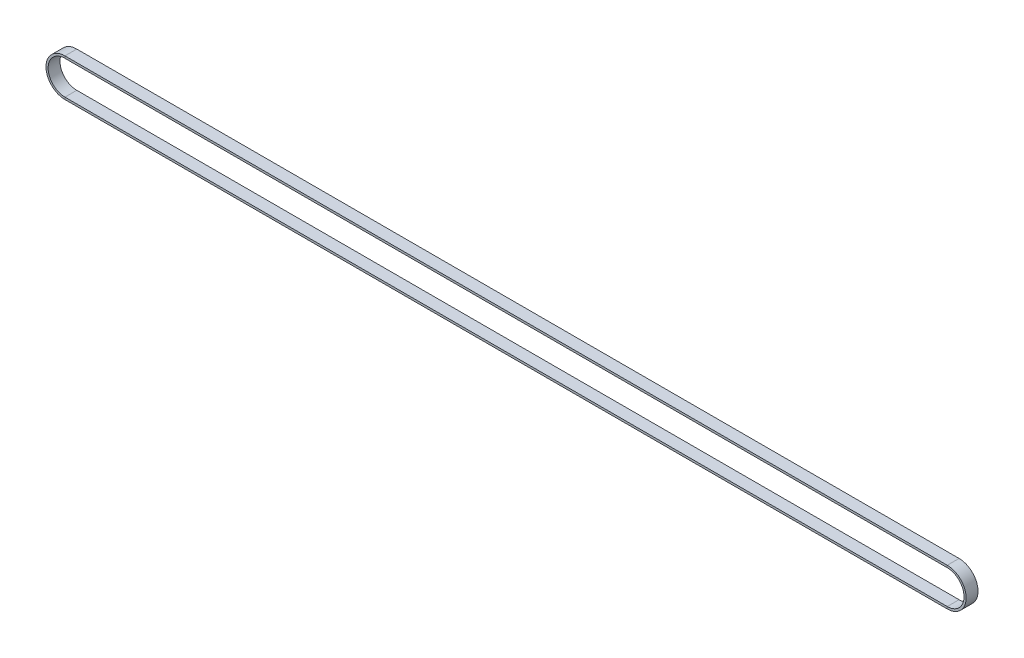
ISO-10303-21;
HEADER;
FILE_DESCRIPTION(('STEP AP214'),'2;1');
FILE_NAME('part.step','',(''),(''),'','','');
FILE_SCHEMA(('AUTOMOTIVE_DESIGN { 1 0 10303 214 1 1 1 1 }'));
ENDSEC;
DATA;
#1=APPLICATION_CONTEXT('core data for automotive mechanical design processes');
#2=APPLICATION_PROTOCOL_DEFINITION('international standard','automotive_design',2000,#1);
#3=PRODUCT_CONTEXT('',#1,'mechanical');
#4=PRODUCT('Part','Part','',(#3));
#5=PRODUCT_RELATED_PRODUCT_CATEGORY('part','',(#4));
#6=PRODUCT_DEFINITION_FORMATION('','',#4);
#7=PRODUCT_DEFINITION_CONTEXT('part definition',#1,'design');
#8=PRODUCT_DEFINITION('design','',#6,#7);
#9=PRODUCT_DEFINITION_SHAPE('','',#8);
#10=(LENGTH_UNIT() NAMED_UNIT(*) SI_UNIT(.MILLI.,.METRE.));
#11=(NAMED_UNIT(*) PLANE_ANGLE_UNIT() SI_UNIT($,.RADIAN.));
#12=(NAMED_UNIT(*) SI_UNIT($,.STERADIAN.) SOLID_ANGLE_UNIT());
#13=UNCERTAINTY_MEASURE_WITH_UNIT(LENGTH_MEASURE(1.E-05),#10,'distance_accuracy_value','');
#14=(GEOMETRIC_REPRESENTATION_CONTEXT(3) GLOBAL_UNCERTAINTY_ASSIGNED_CONTEXT((#13)) GLOBAL_UNIT_ASSIGNED_CONTEXT((#10,
#11,#12)) REPRESENTATION_CONTEXT('',''));
#15=CARTESIAN_POINT('',(0.,0.,0.));
#16=DIRECTION('',(0.,0.,1.));
#17=DIRECTION('',(1.,0.,0.));
#18=AXIS2_PLACEMENT_3D('',#15,#16,#17);
#19=CARTESIAN_POINT('',(478.303918639528,3.80131201328021,-3.175));
#20=DIRECTION('',(0.,-1.,0.));
#21=DIRECTION('',(1.,0.,0.));
#22=AXIS2_PLACEMENT_3D('',#19,#20,#21);
#23=PLANE('',#22);
#24=DIRECTION('',(0.,0.,1.));
#25=VECTOR('',#24,1.);
#26=CARTESIAN_POINT('',(478.303918639528,3.80131201328021,-3.175));
#27=LINE('',#26,#25);
#28=CARTESIAN_POINT('',(478.303918639528,3.80131201328021,-3.175));
#29=VERTEX_POINT('',#28);
#30=CARTESIAN_POINT('',(478.303918639528,3.80131201328021,3.175));
#31=VERTEX_POINT('',#30);
#32=EDGE_CURVE('E155',#29,#31,#27,.T.);
#33=ORIENTED_EDGE('',*,*,#32,.F.);
#34=DIRECTION('',(-1.,0.,0.));
#35=VECTOR('',#34,1.);
#36=CARTESIAN_POINT('',(478.303918639528,3.80131201328021,-3.175));
#37=LINE('',#36,#35);
#38=CARTESIAN_POINT('',(4.76250000000024,3.80131201327766,-3.175));
#39=VERTEX_POINT('',#38);
#40=EDGE_CURVE('E154',#29,#39,#37,.T.);
#41=ORIENTED_EDGE('',*,*,#40,.T.);
#42=DIRECTION('',(0.,0.,1.));
#43=VECTOR('',#42,1.);
#44=CARTESIAN_POINT('',(4.76250000000024,3.80131201327766,-3.175));
#45=LINE('',#44,#43);
#46=CARTESIAN_POINT('',(4.76250000000024,3.80131201327765,3.175));
#47=VERTEX_POINT('',#46);
#48=EDGE_CURVE('E133',#39,#47,#45,.T.);
#49=ORIENTED_EDGE('',*,*,#48,.T.);
#50=DIRECTION('',(-1.,0.,0.));
#51=VECTOR('',#50,1.);
#52=CARTESIAN_POINT('',(478.303918639528,3.80131201328021,3.175));
#53=LINE('',#52,#51);
#54=EDGE_CURVE('E159',#31,#47,#53,.T.);
#55=ORIENTED_EDGE('',*,*,#54,.F.);
#56=EDGE_LOOP('',(#33,#41,#49,#55));
#57=FACE_BOUND('',#56,.T.);
#58=ADVANCED_FACE('F39',(#57),#23,.F.);
#59=CARTESIAN_POINT('',(4.76250000000029,-6.35868798672234,0.));
#60=DIRECTION('',(0.,0.,1.));
#61=DIRECTION('',(1.,0.,0.));
#62=AXIS2_PLACEMENT_3D('',#59,#60,#61);
#63=CYLINDRICAL_SURFACE('',#62,10.16);
#64=CARTESIAN_POINT('',(4.76250000000029,-6.35868798672234,3.175));
#65=DIRECTION('',(0.,0.,1.));
#66=DIRECTION('',(0.,1.,0.));
#67=AXIS2_PLACEMENT_3D('',#64,#65,#66);
#68=CIRCLE('',#67,10.16);
#69=CARTESIAN_POINT('',(4.76250000000035,-16.5186879867223,3.175));
#70=VERTEX_POINT('',#69);
#71=EDGE_CURVE('E123',#47,#70,#68,.T.);
#72=ORIENTED_EDGE('',*,*,#71,.F.);
#73=ORIENTED_EDGE('',*,*,#48,.F.);
#74=CARTESIAN_POINT('',(4.76250000000029,-6.35868798672234,-3.175));
#75=DIRECTION('',(0.,0.,1.));
#76=DIRECTION('',(0.,1.,0.));
#77=AXIS2_PLACEMENT_3D('',#74,#75,#76);
#78=CIRCLE('',#77,10.16);
#79=CARTESIAN_POINT('',(4.76250000000035,-16.5186879867223,-3.175));
#80=VERTEX_POINT('',#79);
#81=EDGE_CURVE('E136',#39,#80,#78,.T.);
#82=ORIENTED_EDGE('',*,*,#81,.T.);
#83=DIRECTION('',(0.,0.,1.));
#84=VECTOR('',#83,1.);
#85=CARTESIAN_POINT('',(4.76250000000035,-16.5186879867223,-3.175));
#86=LINE('',#85,#84);
#87=EDGE_CURVE('E151',#80,#70,#86,.T.);
#88=ORIENTED_EDGE('',*,*,#87,.T.);
#89=EDGE_LOOP('',(#72,#73,#82,#88));
#90=FACE_BOUND('',#89,.T.);
#91=ADVANCED_FACE('F135',(#90),#63,.T.);
#92=CARTESIAN_POINT('',(4.76250000000023,2.65831201327766,3.175));
#93=DIRECTION('',(0.,0.,-1.));
#94=DIRECTION('',(-1.,0.,0.));
#95=AXIS2_PLACEMENT_3D('',#92,#93,#94);
#96=PLANE('',#95);
#97=CARTESIAN_POINT('',(4.76250000000029,-6.35868798672234,3.175));
#98=DIRECTION('',(0.,0.,1.));
#99=DIRECTION('',(0.,1.,0.));
#100=AXIS2_PLACEMENT_3D('',#97,#98,#99);
#101=CIRCLE('',#100,9.017);
#102=CARTESIAN_POINT('',(4.76250000000023,2.65831201327766,3.175));
#103=VERTEX_POINT('',#102);
#104=CARTESIAN_POINT('',(4.76250000000036,-15.3756879867223,3.175));
#105=VERTEX_POINT('',#104);
#106=EDGE_CURVE('E117',#103,#105,#101,.T.);
#107=ORIENTED_EDGE('',*,*,#106,.F.);
#108=DIRECTION('',(0.,-1.,0.));
#109=VECTOR('',#108,1.);
#110=CARTESIAN_POINT('',(4.76250000000023,2.65831201327766,3.175));
#111=LINE('',#110,#109);
#112=EDGE_CURVE('E141',#47,#103,#111,.T.);
#113=ORIENTED_EDGE('',*,*,#112,.F.);
#114=ORIENTED_EDGE('',*,*,#71,.T.);
#115=DIRECTION('',(0.,1.,0.));
#116=VECTOR('',#115,1.);
#117=CARTESIAN_POINT('',(4.76250000000036,-15.3756879867223,3.175));
#118=LINE('',#117,#116);
#119=EDGE_CURVE('E199',#70,#105,#118,.T.);
#120=ORIENTED_EDGE('',*,*,#119,.T.);
#121=EDGE_LOOP('',(#107,#113,#114,#120));
#122=FACE_BOUND('',#121,.T.);
#123=ADVANCED_FACE('F218',(#122),#96,.F.);
#124=CARTESIAN_POINT('',(4.76250000000029,-6.35868798672234,0.));
#125=DIRECTION('',(0.,0.,1.));
#126=DIRECTION('',(1.,0.,0.));
#127=AXIS2_PLACEMENT_3D('',#124,#125,#126);
#128=CYLINDRICAL_SURFACE('',#127,9.017);
#129=CARTESIAN_POINT('',(4.76250000000029,-6.35868798672234,-3.175));
#130=DIRECTION('',(0.,0.,1.));
#131=DIRECTION('',(0.,1.,0.));
#132=AXIS2_PLACEMENT_3D('',#129,#130,#131);
#133=CIRCLE('',#132,9.017);
#134=CARTESIAN_POINT('',(4.76250000000023,2.65831201327766,-3.175));
#135=VERTEX_POINT('',#134);
#136=CARTESIAN_POINT('',(4.76250000000036,-15.3756879867223,-3.175));
#137=VERTEX_POINT('',#136);
#138=EDGE_CURVE('E169',#135,#137,#133,.T.);
#139=ORIENTED_EDGE('',*,*,#138,.F.);
#140=DIRECTION('',(0.,0.,-1.));
#141=VECTOR('',#140,1.);
#142=CARTESIAN_POINT('',(4.76250000000023,2.65831201327766,3.175));
#143=LINE('',#142,#141);
#144=EDGE_CURVE('E162',#103,#135,#143,.T.);
#145=ORIENTED_EDGE('',*,*,#144,.F.);
#146=ORIENTED_EDGE('',*,*,#106,.T.);
#147=DIRECTION('',(0.,0.,-1.));
#148=VECTOR('',#147,1.);
#149=CARTESIAN_POINT('',(4.76250000000036,-15.3756879867223,3.175));
#150=LINE('',#149,#148);
#151=EDGE_CURVE('E187',#105,#137,#150,.T.);
#152=ORIENTED_EDGE('',*,*,#151,.T.);
#153=EDGE_LOOP('',(#139,#145,#146,#152));
#154=FACE_BOUND('',#153,.T.);
#155=ADVANCED_FACE('F186',(#154),#128,.F.);
#156=CARTESIAN_POINT('',(4.76250000000023,2.65831201327766,-3.175));
#157=DIRECTION('',(0.,0.,1.));
#158=DIRECTION('',(1.,0.,0.));
#159=AXIS2_PLACEMENT_3D('',#156,#157,#158);
#160=PLANE('',#159);
#161=DIRECTION('',(0.,-1.,0.));
#162=VECTOR('',#161,1.);
#163=CARTESIAN_POINT('',(4.76250000000036,-15.3756879867223,-3.175));
#164=LINE('',#163,#162);
#165=EDGE_CURVE('E149',#137,#80,#164,.T.);
#166=ORIENTED_EDGE('',*,*,#165,.T.);
#167=ORIENTED_EDGE('',*,*,#81,.F.);
#168=DIRECTION('',(0.,1.,0.));
#169=VECTOR('',#168,1.);
#170=CARTESIAN_POINT('',(4.76250000000023,2.65831201327766,-3.175));
#171=LINE('',#170,#169);
#172=EDGE_CURVE('E148',#135,#39,#171,.T.);
#173=ORIENTED_EDGE('',*,*,#172,.F.);
#174=ORIENTED_EDGE('',*,*,#138,.T.);
#175=EDGE_LOOP('',(#166,#167,#173,#174));
#176=FACE_BOUND('',#175,.T.);
#177=ADVANCED_FACE('F146',(#176),#160,.F.);
#178=CARTESIAN_POINT('',(4.76250000000034,-16.5186879867223,-3.175));
#179=DIRECTION('',(0.,1.,0.));
#180=DIRECTION('',(-1.,0.,0.));
#181=AXIS2_PLACEMENT_3D('',#178,#179,#180);
#182=PLANE('',#181);
#183=DIRECTION('',(1.,0.,0.));
#184=VECTOR('',#183,1.);
#185=CARTESIAN_POINT('',(4.76250000000034,-16.5186879867223,3.175));
#186=LINE('',#185,#184);
#187=CARTESIAN_POINT('',(478.303918639528,-16.5186879867198,3.175));
#188=VERTEX_POINT('',#187);
#189=EDGE_CURVE('E104',#70,#188,#186,.T.);
#190=ORIENTED_EDGE('',*,*,#189,.F.);
#191=ORIENTED_EDGE('',*,*,#87,.F.);
#192=DIRECTION('',(1.,0.,0.));
#193=VECTOR('',#192,1.);
#194=CARTESIAN_POINT('',(4.76250000000034,-16.5186879867223,-3.175));
#195=LINE('',#194,#193);
#196=CARTESIAN_POINT('',(478.303918639528,-16.5186879867198,-3.175));
#197=VERTEX_POINT('',#196);
#198=EDGE_CURVE('E168',#80,#197,#195,.T.);
#199=ORIENTED_EDGE('',*,*,#198,.T.);
#200=DIRECTION('',(0.,0.,1.));
#201=VECTOR('',#200,1.);
#202=CARTESIAN_POINT('',(478.303918639528,-16.5186879867198,-3.175));
#203=LINE('',#202,#201);
#204=EDGE_CURVE('E209',#197,#188,#203,.T.);
#205=ORIENTED_EDGE('',*,*,#204,.T.);
#206=EDGE_LOOP('',(#190,#191,#199,#205));
#207=FACE_BOUND('',#206,.T.);
#208=ADVANCED_FACE('F214',(#207),#182,.F.);
#209=CARTESIAN_POINT('',(4.76250000000035,-15.3756879867223,3.175));
#210=DIRECTION('',(0.,0.,-1.));
#211=DIRECTION('',(0.,1.,0.));
#212=AXIS2_PLACEMENT_3D('',#209,#210,#211);
#213=PLANE('',#212);
#214=DIRECTION('',(1.,0.,0.));
#215=VECTOR('',#214,1.);
#216=CARTESIAN_POINT('',(4.76250000000035,-15.3756879867223,3.175));
#217=LINE('',#216,#215);
#218=CARTESIAN_POINT('',(478.303918639528,-15.3756879867198,3.175));
#219=VERTEX_POINT('',#218);
#220=EDGE_CURVE('E97',#105,#219,#217,.T.);
#221=ORIENTED_EDGE('',*,*,#220,.F.);
#222=ORIENTED_EDGE('',*,*,#119,.F.);
#223=ORIENTED_EDGE('',*,*,#189,.T.);
#224=DIRECTION('',(0.,1.,0.));
#225=VECTOR('',#224,1.);
#226=CARTESIAN_POINT('',(478.303918639528,-15.3756879867198,3.175));
#227=LINE('',#226,#225);
#228=EDGE_CURVE('E196',#188,#219,#227,.T.);
#229=ORIENTED_EDGE('',*,*,#228,.T.);
#230=EDGE_LOOP('',(#221,#222,#223,#229));
#231=FACE_BOUND('',#230,.T.);
#232=ADVANCED_FACE('F217',(#231),#213,.F.);
#233=CARTESIAN_POINT('',(4.76250000000035,-15.3756879867223,3.175));
#234=DIRECTION('',(0.,-1.,0.));
#235=DIRECTION('',(1.,0.,0.));
#236=AXIS2_PLACEMENT_3D('',#233,#234,#235);
#237=PLANE('',#236);
#238=DIRECTION('',(1.,0.,0.));
#239=VECTOR('',#238,1.);
#240=CARTESIAN_POINT('',(4.76250000000035,-15.3756879867223,-3.175));
#241=LINE('',#240,#239);
#242=CARTESIAN_POINT('',(478.303918639528,-15.3756879867198,-3.175));
#243=VERTEX_POINT('',#242);
#244=EDGE_CURVE('E88',#137,#243,#241,.T.);
#245=ORIENTED_EDGE('',*,*,#244,.F.);
#246=ORIENTED_EDGE('',*,*,#151,.F.);
#247=ORIENTED_EDGE('',*,*,#220,.T.);
#248=DIRECTION('',(0.,0.,-1.));
#249=VECTOR('',#248,1.);
#250=CARTESIAN_POINT('',(478.303918639528,-15.3756879867198,3.175));
#251=LINE('',#250,#249);
#252=EDGE_CURVE('E174',#219,#243,#251,.T.);
#253=ORIENTED_EDGE('',*,*,#252,.T.);
#254=EDGE_LOOP('',(#245,#246,#247,#253));
#255=FACE_BOUND('',#254,.T.);
#256=ADVANCED_FACE('F236',(#255),#237,.F.);
#257=CARTESIAN_POINT('',(4.76250000000035,-15.3756879867223,-3.175));
#258=DIRECTION('',(0.,0.,1.));
#259=DIRECTION('',(0.,-1.,0.));
#260=AXIS2_PLACEMENT_3D('',#257,#258,#259);
#261=PLANE('',#260);
#262=DIRECTION('',(0.,-1.,0.));
#263=VECTOR('',#262,1.);
#264=CARTESIAN_POINT('',(478.303918639528,-15.3756879867198,-3.175));
#265=LINE('',#264,#263);
#266=EDGE_CURVE('E170',#243,#197,#265,.T.);
#267=ORIENTED_EDGE('',*,*,#266,.T.);
#268=ORIENTED_EDGE('',*,*,#198,.F.);
#269=ORIENTED_EDGE('',*,*,#165,.F.);
#270=ORIENTED_EDGE('',*,*,#244,.T.);
#271=EDGE_LOOP('',(#267,#268,#269,#270));
#272=FACE_BOUND('',#271,.T.);
#273=ADVANCED_FACE('F228',(#272),#261,.F.);
#274=CARTESIAN_POINT('',(478.303918639528,-6.35868798671979,0.));
#275=DIRECTION('',(0.,0.,1.));
#276=DIRECTION('',(1.,0.,0.));
#277=AXIS2_PLACEMENT_3D('',#274,#275,#276);
#278=CYLINDRICAL_SURFACE('',#277,10.16);
#279=CARTESIAN_POINT('',(478.303918639528,-6.35868798671979,3.175));
#280=DIRECTION('',(0.,0.,1.));
#281=DIRECTION('',(0.,-1.,0.));
#282=AXIS2_PLACEMENT_3D('',#279,#280,#281);
#283=CIRCLE('',#282,10.16);
#284=EDGE_CURVE('E194',#188,#31,#283,.T.);
#285=ORIENTED_EDGE('',*,*,#284,.F.);
#286=ORIENTED_EDGE('',*,*,#204,.F.);
#287=CARTESIAN_POINT('',(478.303918639528,-6.35868798671979,-3.175));
#288=DIRECTION('',(0.,0.,1.));
#289=DIRECTION('',(0.,-1.,0.));
#290=AXIS2_PLACEMENT_3D('',#287,#288,#289);
#291=CIRCLE('',#290,10.16);
#292=EDGE_CURVE('E171',#197,#29,#291,.T.);
#293=ORIENTED_EDGE('',*,*,#292,.T.);
#294=ORIENTED_EDGE('',*,*,#32,.T.);
#295=EDGE_LOOP('',(#285,#286,#293,#294));
#296=FACE_BOUND('',#295,.T.);
#297=ADVANCED_FACE('F226',(#296),#278,.T.);
#298=CARTESIAN_POINT('',(478.303918639528,-15.3756879867198,3.175));
#299=DIRECTION('',(0.,0.,-1.));
#300=DIRECTION('',(-1.,0.,0.));
#301=AXIS2_PLACEMENT_3D('',#298,#299,#300);
#302=PLANE('',#301);
#303=CARTESIAN_POINT('',(478.303918639528,-6.35868798671979,3.175));
#304=DIRECTION('',(0.,0.,1.));
#305=DIRECTION('',(0.,-1.,0.));
#306=AXIS2_PLACEMENT_3D('',#303,#304,#305);
#307=CIRCLE('',#306,9.017);
#308=CARTESIAN_POINT('',(478.303918639528,2.65831201328021,3.175));
#309=VERTEX_POINT('',#308);
#310=EDGE_CURVE('E64',#219,#309,#307,.T.);
#311=ORIENTED_EDGE('',*,*,#310,.F.);
#312=ORIENTED_EDGE('',*,*,#228,.F.);
#313=ORIENTED_EDGE('',*,*,#284,.T.);
#314=DIRECTION('',(0.,-1.,0.));
#315=VECTOR('',#314,1.);
#316=CARTESIAN_POINT('',(478.303918639528,2.65831201328021,3.175));
#317=LINE('',#316,#315);
#318=EDGE_CURVE('E192',#31,#309,#317,.T.);
#319=ORIENTED_EDGE('',*,*,#318,.T.);
#320=EDGE_LOOP('',(#311,#312,#313,#319));
#321=FACE_BOUND('',#320,.T.);
#322=ADVANCED_FACE('F223',(#321),#302,.F.);
#323=CARTESIAN_POINT('',(478.303918639528,-6.35868798671979,0.));
#324=DIRECTION('',(0.,0.,1.));
#325=DIRECTION('',(1.,0.,0.));
#326=AXIS2_PLACEMENT_3D('',#323,#324,#325);
#327=CYLINDRICAL_SURFACE('',#326,9.017);
#328=CARTESIAN_POINT('',(478.303918639528,-6.35868798671979,-3.175));
#329=DIRECTION('',(0.,0.,1.));
#330=DIRECTION('',(0.,-1.,0.));
#331=AXIS2_PLACEMENT_3D('',#328,#329,#330);
#332=CIRCLE('',#331,9.017);
#333=CARTESIAN_POINT('',(478.303918639528,2.65831201328021,-3.175));
#334=VERTEX_POINT('',#333);
#335=EDGE_CURVE('E56',#243,#334,#332,.T.);
#336=ORIENTED_EDGE('',*,*,#335,.F.);
#337=ORIENTED_EDGE('',*,*,#252,.F.);
#338=ORIENTED_EDGE('',*,*,#310,.T.);
#339=DIRECTION('',(0.,0.,-1.));
#340=VECTOR('',#339,1.);
#341=CARTESIAN_POINT('',(478.303918639528,2.65831201328021,3.175));
#342=LINE('',#341,#340);
#343=EDGE_CURVE('E179',#309,#334,#342,.T.);
#344=ORIENTED_EDGE('',*,*,#343,.T.);
#345=EDGE_LOOP('',(#336,#337,#338,#344));
#346=FACE_BOUND('',#345,.T.);
#347=ADVANCED_FACE('F234',(#346),#327,.F.);
#348=CARTESIAN_POINT('',(478.303918639528,-15.3756879867198,-3.175));
#349=DIRECTION('',(0.,0.,1.));
#350=DIRECTION('',(1.,0.,0.));
#351=AXIS2_PLACEMENT_3D('',#348,#349,#350);
#352=PLANE('',#351);
#353=DIRECTION('',(0.,1.,0.));
#354=VECTOR('',#353,1.);
#355=CARTESIAN_POINT('',(478.303918639528,2.65831201328021,-3.175));
#356=LINE('',#355,#354);
#357=EDGE_CURVE('E43',#334,#29,#356,.T.);
#358=ORIENTED_EDGE('',*,*,#357,.T.);
#359=ORIENTED_EDGE('',*,*,#292,.F.);
#360=ORIENTED_EDGE('',*,*,#266,.F.);
#361=ORIENTED_EDGE('',*,*,#335,.T.);
#362=EDGE_LOOP('',(#358,#359,#360,#361));
#363=FACE_BOUND('',#362,.T.);
#364=ADVANCED_FACE('F180',(#363),#352,.F.);
#365=CARTESIAN_POINT('',(478.303918639528,2.65831201328021,3.175));
#366=DIRECTION('',(0.,0.,-1.));
#367=DIRECTION('',(0.,1.,0.));
#368=AXIS2_PLACEMENT_3D('',#365,#366,#367);
#369=PLANE('',#368);
#370=ORIENTED_EDGE('',*,*,#54,.T.);
#371=ORIENTED_EDGE('',*,*,#112,.T.);
#372=DIRECTION('',(-1.,0.,0.));
#373=VECTOR('',#372,1.);
#374=CARTESIAN_POINT('',(478.303918639528,2.65831201328021,3.175));
#375=LINE('',#374,#373);
#376=EDGE_CURVE('E48',#309,#103,#375,.T.);
#377=ORIENTED_EDGE('',*,*,#376,.F.);
#378=ORIENTED_EDGE('',*,*,#318,.F.);
#379=EDGE_LOOP('',(#370,#371,#377,#378));
#380=FACE_BOUND('',#379,.T.);
#381=ADVANCED_FACE('F220',(#380),#369,.F.);
#382=CARTESIAN_POINT('',(478.303918639528,2.65831201328021,3.175));
#383=DIRECTION('',(0.,1.,0.));
#384=DIRECTION('',(-1.,0.,0.));
#385=AXIS2_PLACEMENT_3D('',#382,#383,#384);
#386=PLANE('',#385);
#387=ORIENTED_EDGE('',*,*,#376,.T.);
#388=ORIENTED_EDGE('',*,*,#144,.T.);
#389=DIRECTION('',(-1.,0.,0.));
#390=VECTOR('',#389,1.);
#391=CARTESIAN_POINT('',(478.303918639528,2.65831201328021,-3.175));
#392=LINE('',#391,#390);
#393=EDGE_CURVE('E11',#334,#135,#392,.T.);
#394=ORIENTED_EDGE('',*,*,#393,.F.);
#395=ORIENTED_EDGE('',*,*,#343,.F.);
#396=EDGE_LOOP('',(#387,#388,#394,#395));
#397=FACE_BOUND('',#396,.T.);
#398=ADVANCED_FACE('F184',(#397),#386,.F.);
#399=CARTESIAN_POINT('',(478.303918639528,2.65831201328021,-3.175));
#400=DIRECTION('',(0.,0.,1.));
#401=DIRECTION('',(0.,-1.,0.));
#402=AXIS2_PLACEMENT_3D('',#399,#400,#401);
#403=PLANE('',#402);
#404=ORIENTED_EDGE('',*,*,#393,.T.);
#405=ORIENTED_EDGE('',*,*,#172,.T.);
#406=ORIENTED_EDGE('',*,*,#40,.F.);
#407=ORIENTED_EDGE('',*,*,#357,.F.);
#408=EDGE_LOOP('',(#404,#405,#406,#407));
#409=FACE_BOUND('',#408,.T.);
#410=ADVANCED_FACE('F41',(#409),#403,.F.);
#411=CLOSED_SHELL('',(#58,#91,#123,#155,#177,#208,#232,#256,#273,#297,#322,#347,#364,#381,#398,#410));
#412=MANIFOLD_SOLID_BREP('B2',#411);
#413=ADVANCED_BREP_SHAPE_REPRESENTATION('',(#18,#412),#14);
#414=SHAPE_DEFINITION_REPRESENTATION(#9,#413);
ENDSEC;
END-ISO-10303-21;
